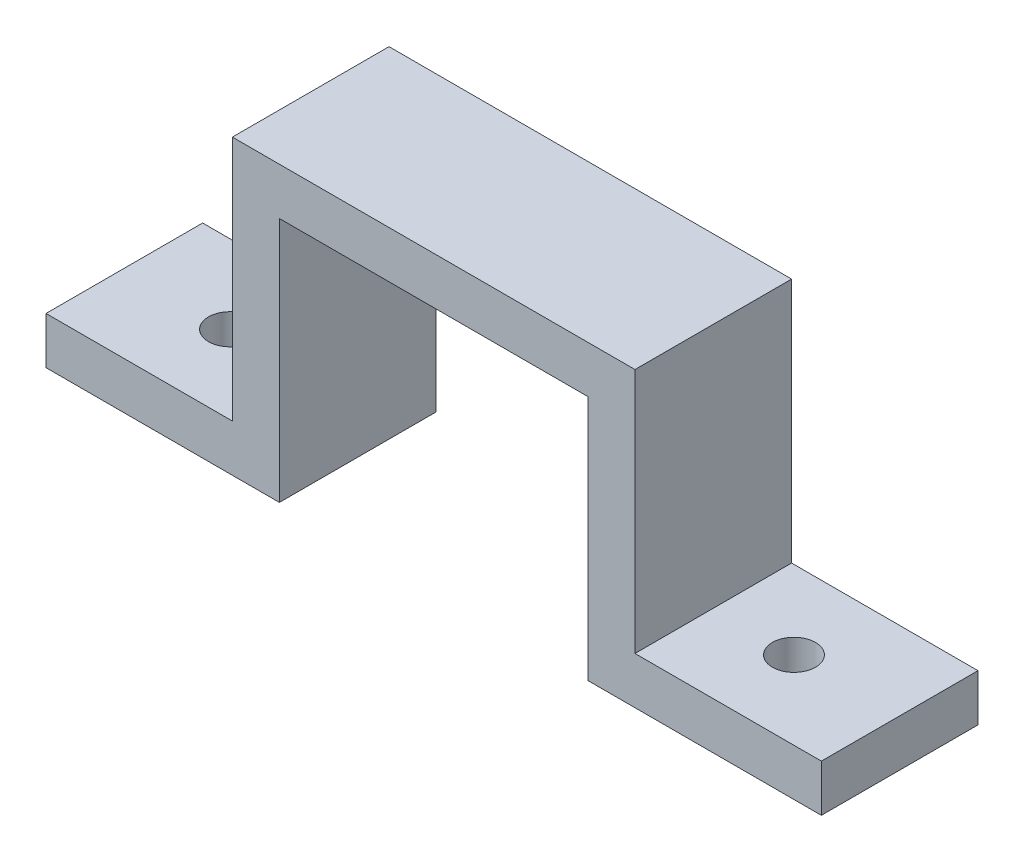
ISO-10303-21;
HEADER;
FILE_DESCRIPTION(('STEP AP214'),'2;1');
FILE_NAME('part.step','',(''),(''),'','','');
FILE_SCHEMA(('AUTOMOTIVE_DESIGN { 1 0 10303 214 1 1 1 1 }'));
ENDSEC;
DATA;
#1=APPLICATION_CONTEXT('core data for automotive mechanical design processes');
#2=APPLICATION_PROTOCOL_DEFINITION('international standard','automotive_design',2000,#1);
#3=PRODUCT_CONTEXT('',#1,'mechanical');
#4=PRODUCT('Part','Part','',(#3));
#5=PRODUCT_RELATED_PRODUCT_CATEGORY('part','',(#4));
#6=PRODUCT_DEFINITION_FORMATION('','',#4);
#7=PRODUCT_DEFINITION_CONTEXT('part definition',#1,'design');
#8=PRODUCT_DEFINITION('design','',#6,#7);
#9=PRODUCT_DEFINITION_SHAPE('','',#8);
#10=(LENGTH_UNIT() NAMED_UNIT(*) SI_UNIT(.MILLI.,.METRE.));
#11=(NAMED_UNIT(*) PLANE_ANGLE_UNIT() SI_UNIT($,.RADIAN.));
#12=(NAMED_UNIT(*) SI_UNIT($,.STERADIAN.) SOLID_ANGLE_UNIT());
#13=UNCERTAINTY_MEASURE_WITH_UNIT(LENGTH_MEASURE(1.E-05),#10,'distance_accuracy_value','');
#14=(GEOMETRIC_REPRESENTATION_CONTEXT(3) GLOBAL_UNCERTAINTY_ASSIGNED_CONTEXT((#13)) GLOBAL_UNIT_ASSIGNED_CONTEXT((#10,
#11,#12)) REPRESENTATION_CONTEXT('',''));
#15=CARTESIAN_POINT('',(0.,0.,0.));
#16=DIRECTION('',(0.,0.,1.));
#17=DIRECTION('',(1.,0.,0.));
#18=AXIS2_PLACEMENT_3D('',#15,#16,#17);
#19=CARTESIAN_POINT('',(0.,3.,0.));
#20=DIRECTION('',(0.,0.,-1.));
#21=DIRECTION('',(-1.,0.,0.));
#22=AXIS2_PLACEMENT_3D('',#19,#20,#21);
#23=PLANE('',#22);
#24=DIRECTION('',(1.,0.,0.));
#25=VECTOR('',#24,1.);
#26=CARTESIAN_POINT('',(0.,0.,0.));
#27=LINE('',#26,#25);
#28=CARTESIAN_POINT('',(34.6,0.,0.));
#29=VERTEX_POINT('',#28);
#30=CARTESIAN_POINT('',(49.5,0.,0.));
#31=VERTEX_POINT('',#30);
#32=EDGE_CURVE('E213',#29,#31,#27,.T.);
#33=ORIENTED_EDGE('',*,*,#32,.F.);
#34=DIRECTION('',(0.,-1.,0.));
#35=VECTOR('',#34,1.);
#36=CARTESIAN_POINT('',(34.6,18.7,0.));
#37=LINE('',#36,#35);
#38=CARTESIAN_POINT('',(34.6,15.7,0.));
#39=VERTEX_POINT('',#38);
#40=EDGE_CURVE('E209',#39,#29,#37,.T.);
#41=ORIENTED_EDGE('',*,*,#40,.F.);
#42=DIRECTION('',(-1.,0.,0.));
#43=VECTOR('',#42,1.);
#44=CARTESIAN_POINT('',(49.502,15.7,0.));
#45=LINE('',#44,#43);
#46=CARTESIAN_POINT('',(14.9,15.7,0.));
#47=VERTEX_POINT('',#46);
#48=EDGE_CURVE('E51',#39,#47,#45,.T.);
#49=ORIENTED_EDGE('',*,*,#48,.T.);
#50=DIRECTION('',(0.,-1.,0.));
#51=VECTOR('',#50,1.);
#52=CARTESIAN_POINT('',(14.9,18.7,0.));
#53=LINE('',#52,#51);
#54=CARTESIAN_POINT('',(14.9,0.,0.));
#55=VERTEX_POINT('',#54);
#56=EDGE_CURVE('E151',#47,#55,#53,.T.);
#57=ORIENTED_EDGE('',*,*,#56,.T.);
#58=DIRECTION('',(1.,0.,0.));
#59=VECTOR('',#58,1.);
#60=CARTESIAN_POINT('',(0.,0.,0.));
#61=LINE('',#60,#59);
#62=CARTESIAN_POINT('',(0.,0.,0.));
#63=VERTEX_POINT('',#62);
#64=EDGE_CURVE('E181',#63,#55,#61,.T.);
#65=ORIENTED_EDGE('',*,*,#64,.F.);
#66=DIRECTION('',(0.,-1.,0.));
#67=VECTOR('',#66,1.);
#68=CARTESIAN_POINT('',(0.,3.,0.));
#69=LINE('',#68,#67);
#70=CARTESIAN_POINT('',(0.,3.,0.));
#71=VERTEX_POINT('',#70);
#72=EDGE_CURVE('E191',#71,#63,#69,.T.);
#73=ORIENTED_EDGE('',*,*,#72,.F.);
#74=DIRECTION('',(1.,0.,0.));
#75=VECTOR('',#74,1.);
#76=CARTESIAN_POINT('',(0.,3.,0.));
#77=LINE('',#76,#75);
#78=CARTESIAN_POINT('',(11.89875271,3.,0.));
#79=VERTEX_POINT('',#78);
#80=EDGE_CURVE('E148',#71,#79,#77,.T.);
#81=ORIENTED_EDGE('',*,*,#80,.T.);
#82=DIRECTION('',(0.,-1.,0.));
#83=VECTOR('',#82,1.);
#84=CARTESIAN_POINT('',(11.89875271,18.7,0.));
#85=LINE('',#84,#83);
#86=CARTESIAN_POINT('',(11.89875271,18.7,0.));
#87=VERTEX_POINT('',#86);
#88=EDGE_CURVE('E146',#87,#79,#85,.T.);
#89=ORIENTED_EDGE('',*,*,#88,.F.);
#90=DIRECTION('',(1.,0.,0.));
#91=VECTOR('',#90,1.);
#92=CARTESIAN_POINT('',(0.,18.7,0.));
#93=LINE('',#92,#91);
#94=CARTESIAN_POINT('',(37.6,18.7,0.));
#95=VERTEX_POINT('',#94);
#96=EDGE_CURVE('E134',#87,#95,#93,.T.);
#97=ORIENTED_EDGE('',*,*,#96,.T.);
#98=DIRECTION('',(0.,-1.,0.));
#99=VECTOR('',#98,1.);
#100=CARTESIAN_POINT('',(37.6,18.7,0.));
#101=LINE('',#100,#99);
#102=CARTESIAN_POINT('',(37.6,3.,0.));
#103=VERTEX_POINT('',#102);
#104=EDGE_CURVE('E211',#95,#103,#101,.T.);
#105=ORIENTED_EDGE('',*,*,#104,.T.);
#106=DIRECTION('',(1.,0.,0.));
#107=VECTOR('',#106,1.);
#108=CARTESIAN_POINT('',(0.,3.,0.));
#109=LINE('',#108,#107);
#110=CARTESIAN_POINT('',(49.5,3.,0.));
#111=VERTEX_POINT('',#110);
#112=EDGE_CURVE('E214',#103,#111,#109,.T.);
#113=ORIENTED_EDGE('',*,*,#112,.T.);
#114=DIRECTION('',(0.,-1.,0.));
#115=VECTOR('',#114,1.);
#116=CARTESIAN_POINT('',(49.5,3.,0.));
#117=LINE('',#116,#115);
#118=EDGE_CURVE('E44',#111,#31,#117,.T.);
#119=ORIENTED_EDGE('',*,*,#118,.T.);
#120=EDGE_LOOP('',(#33,#41,#49,#57,#65,#73,#81,#89,#97,#105,#113,#119));
#121=FACE_BOUND('',#120,.T.);
#122=ADVANCED_FACE('F37',(#121),#23,.T.);
#123=CARTESIAN_POINT('',(0.,3.,10.));
#124=DIRECTION('',(0.,0.,-1.));
#125=DIRECTION('',(-1.,0.,0.));
#126=AXIS2_PLACEMENT_3D('',#123,#124,#125);
#127=PLANE('',#126);
#128=DIRECTION('',(1.,0.,0.));
#129=VECTOR('',#128,1.);
#130=CARTESIAN_POINT('',(0.,0.,10.));
#131=LINE('',#130,#129);
#132=CARTESIAN_POINT('',(34.6,0.,10.));
#133=VERTEX_POINT('',#132);
#134=CARTESIAN_POINT('',(49.5,0.,10.));
#135=VERTEX_POINT('',#134);
#136=EDGE_CURVE('E227',#133,#135,#131,.T.);
#137=ORIENTED_EDGE('',*,*,#136,.T.);
#138=DIRECTION('',(0.,-1.,0.));
#139=VECTOR('',#138,1.);
#140=CARTESIAN_POINT('',(49.5,3.,10.));
#141=LINE('',#140,#139);
#142=CARTESIAN_POINT('',(49.5,3.,10.));
#143=VERTEX_POINT('',#142);
#144=EDGE_CURVE('E11',#143,#135,#141,.T.);
#145=ORIENTED_EDGE('',*,*,#144,.F.);
#146=DIRECTION('',(1.,0.,0.));
#147=VECTOR('',#146,1.);
#148=CARTESIAN_POINT('',(0.,3.,10.));
#149=LINE('',#148,#147);
#150=CARTESIAN_POINT('',(37.6,3.,10.));
#151=VERTEX_POINT('',#150);
#152=EDGE_CURVE('E219',#151,#143,#149,.T.);
#153=ORIENTED_EDGE('',*,*,#152,.F.);
#154=DIRECTION('',(0.,-1.,0.));
#155=VECTOR('',#154,1.);
#156=CARTESIAN_POINT('',(37.6,18.7,10.));
#157=LINE('',#156,#155);
#158=CARTESIAN_POINT('',(37.6,18.7,10.));
#159=VERTEX_POINT('',#158);
#160=EDGE_CURVE('E77',#159,#151,#157,.T.);
#161=ORIENTED_EDGE('',*,*,#160,.F.);
#162=DIRECTION('',(1.,0.,0.));
#163=VECTOR('',#162,1.);
#164=CARTESIAN_POINT('',(0.,18.7,10.));
#165=LINE('',#164,#163);
#166=CARTESIAN_POINT('',(11.89875271,18.7,10.));
#167=VERTEX_POINT('',#166);
#168=EDGE_CURVE('E142',#167,#159,#165,.T.);
#169=ORIENTED_EDGE('',*,*,#168,.F.);
#170=DIRECTION('',(0.,-1.,0.));
#171=VECTOR('',#170,1.);
#172=CARTESIAN_POINT('',(11.89875271,18.7,10.));
#173=LINE('',#172,#171);
#174=CARTESIAN_POINT('',(11.89875271,3.,10.));
#175=VERTEX_POINT('',#174);
#176=EDGE_CURVE('E152',#167,#175,#173,.T.);
#177=ORIENTED_EDGE('',*,*,#176,.T.);
#178=DIRECTION('',(1.,0.,0.));
#179=VECTOR('',#178,1.);
#180=CARTESIAN_POINT('',(0.,3.,10.));
#181=LINE('',#180,#179);
#182=CARTESIAN_POINT('',(0.,3.,10.));
#183=VERTEX_POINT('',#182);
#184=EDGE_CURVE('E176',#183,#175,#181,.T.);
#185=ORIENTED_EDGE('',*,*,#184,.F.);
#186=DIRECTION('',(0.,-1.,0.));
#187=VECTOR('',#186,1.);
#188=CARTESIAN_POINT('',(0.,3.,10.));
#189=LINE('',#188,#187);
#190=CARTESIAN_POINT('',(0.,0.,10.));
#191=VERTEX_POINT('',#190);
#192=EDGE_CURVE('E178',#183,#191,#189,.T.);
#193=ORIENTED_EDGE('',*,*,#192,.T.);
#194=DIRECTION('',(1.,0.,0.));
#195=VECTOR('',#194,1.);
#196=CARTESIAN_POINT('',(0.,0.,10.));
#197=LINE('',#196,#195);
#198=CARTESIAN_POINT('',(14.9,0.,10.));
#199=VERTEX_POINT('',#198);
#200=EDGE_CURVE('E170',#191,#199,#197,.T.);
#201=ORIENTED_EDGE('',*,*,#200,.T.);
#202=DIRECTION('',(0.,-1.,0.));
#203=VECTOR('',#202,1.);
#204=CARTESIAN_POINT('',(14.9,18.7,10.));
#205=LINE('',#204,#203);
#206=CARTESIAN_POINT('',(14.9,15.7,10.));
#207=VERTEX_POINT('',#206);
#208=EDGE_CURVE('E156',#207,#199,#205,.T.);
#209=ORIENTED_EDGE('',*,*,#208,.F.);
#210=DIRECTION('',(-1.,0.,0.));
#211=VECTOR('',#210,1.);
#212=CARTESIAN_POINT('',(49.502,15.7,10.));
#213=LINE('',#212,#211);
#214=CARTESIAN_POINT('',(34.6,15.7,10.));
#215=VERTEX_POINT('',#214);
#216=EDGE_CURVE('E195',#215,#207,#213,.T.);
#217=ORIENTED_EDGE('',*,*,#216,.F.);
#218=DIRECTION('',(0.,-1.,0.));
#219=VECTOR('',#218,1.);
#220=CARTESIAN_POINT('',(34.6,18.7,10.));
#221=LINE('',#220,#219);
#222=EDGE_CURVE('E207',#215,#133,#221,.T.);
#223=ORIENTED_EDGE('',*,*,#222,.T.);
#224=EDGE_LOOP('',(#137,#145,#153,#161,#169,#177,#185,#193,#201,#209,#217,#223));
#225=FACE_BOUND('',#224,.T.);
#226=ADVANCED_FACE('F254',(#225),#127,.F.);
#227=CARTESIAN_POINT('',(49.5,3.,0.));
#228=DIRECTION('',(1.,0.,0.));
#229=DIRECTION('',(0.,0.,-1.));
#230=AXIS2_PLACEMENT_3D('',#227,#228,#229);
#231=PLANE('',#230);
#232=DIRECTION('',(0.,0.,1.));
#233=VECTOR('',#232,1.);
#234=CARTESIAN_POINT('',(49.5,0.,0.));
#235=LINE('',#234,#233);
#236=EDGE_CURVE('E230',#31,#135,#235,.T.);
#237=ORIENTED_EDGE('',*,*,#236,.F.);
#238=ORIENTED_EDGE('',*,*,#118,.F.);
#239=DIRECTION('',(0.,0.,1.));
#240=VECTOR('',#239,1.);
#241=CARTESIAN_POINT('',(49.5,3.,0.));
#242=LINE('',#241,#240);
#243=EDGE_CURVE('E221',#111,#143,#242,.T.);
#244=ORIENTED_EDGE('',*,*,#243,.T.);
#245=ORIENTED_EDGE('',*,*,#144,.T.);
#246=EDGE_LOOP('',(#237,#238,#244,#245));
#247=FACE_BOUND('',#246,.T.);
#248=ADVANCED_FACE('F258',(#247),#231,.T.);
#249=CARTESIAN_POINT('',(42.75,3.,5.));
#250=DIRECTION('',(0.,-1.,0.));
#251=DIRECTION('',(0.,0.,-1.));
#252=AXIS2_PLACEMENT_3D('',#249,#250,#251);
#253=CYLINDRICAL_SURFACE('',#252,1.375);
#254=CARTESIAN_POINT('',(42.75,3.,5.));
#255=DIRECTION('',(0.,1.,0.));
#256=DIRECTION('',(0.,0.,1.));
#257=AXIS2_PLACEMENT_3D('',#254,#255,#256);
#258=CIRCLE('',#257,1.375);
#259=CARTESIAN_POINT('',(42.75,3.,6.375));
#260=VERTEX_POINT('',#259);
#261=EDGE_CURVE('E223',#260,#260,#258,.F.);
#262=ORIENTED_EDGE('',*,*,#261,.F.);
#263=EDGE_LOOP('',(#262));
#264=FACE_BOUND('',#263,.T.);
#265=CARTESIAN_POINT('',(42.75,0.,5.));
#266=DIRECTION('',(0.,1.,0.));
#267=DIRECTION('',(0.,0.,1.));
#268=AXIS2_PLACEMENT_3D('',#265,#266,#267);
#269=CIRCLE('',#268,1.375);
#270=CARTESIAN_POINT('',(42.75,0.,6.375));
#271=VERTEX_POINT('',#270);
#272=EDGE_CURVE('E217',#271,#271,#269,.F.);
#273=ORIENTED_EDGE('',*,*,#272,.T.);
#274=EDGE_LOOP('',(#273));
#275=FACE_BOUND('',#274,.T.);
#276=ADVANCED_FACE('F236',(#264,#275),#253,.F.);
#277=CARTESIAN_POINT('',(0.,3.,0.));
#278=DIRECTION('',(0.,1.,0.));
#279=DIRECTION('',(0.,0.,1.));
#280=AXIS2_PLACEMENT_3D('',#277,#278,#279);
#281=PLANE('',#280);
#282=ORIENTED_EDGE('',*,*,#112,.F.);
#283=DIRECTION('',(0.,0.,1.));
#284=VECTOR('',#283,1.);
#285=CARTESIAN_POINT('',(37.6,3.,0.));
#286=LINE('',#285,#284);
#287=EDGE_CURVE('E216',#103,#151,#286,.T.);
#288=ORIENTED_EDGE('',*,*,#287,.T.);
#289=ORIENTED_EDGE('',*,*,#152,.T.);
#290=ORIENTED_EDGE('',*,*,#243,.F.);
#291=EDGE_LOOP('',(#282,#288,#289,#290));
#292=FACE_BOUND('',#291,.T.);
#293=ORIENTED_EDGE('',*,*,#261,.T.);
#294=EDGE_LOOP('',(#293));
#295=FACE_BOUND('',#294,.T.);
#296=ADVANCED_FACE('F241',(#292,#295),#281,.T.);
#297=CARTESIAN_POINT('',(0.,0.,0.));
#298=DIRECTION('',(0.,1.,0.));
#299=DIRECTION('',(0.,0.,1.));
#300=AXIS2_PLACEMENT_3D('',#297,#298,#299);
#301=PLANE('',#300);
#302=ORIENTED_EDGE('',*,*,#32,.T.);
#303=ORIENTED_EDGE('',*,*,#236,.T.);
#304=ORIENTED_EDGE('',*,*,#136,.F.);
#305=DIRECTION('',(0.,0.,1.));
#306=VECTOR('',#305,1.);
#307=CARTESIAN_POINT('',(34.6,0.,0.));
#308=LINE('',#307,#306);
#309=EDGE_CURVE('E201',#29,#133,#308,.T.);
#310=ORIENTED_EDGE('',*,*,#309,.F.);
#311=EDGE_LOOP('',(#302,#303,#304,#310));
#312=FACE_BOUND('',#311,.T.);
#313=ORIENTED_EDGE('',*,*,#272,.F.);
#314=EDGE_LOOP('',(#313));
#315=FACE_BOUND('',#314,.T.);
#316=ADVANCED_FACE('F238',(#312,#315),#301,.F.);
#317=CARTESIAN_POINT('',(37.6,18.7,0.));
#318=DIRECTION('',(1.,0.,0.));
#319=DIRECTION('',(0.,0.,-1.));
#320=AXIS2_PLACEMENT_3D('',#317,#318,#319);
#321=PLANE('',#320);
#322=ORIENTED_EDGE('',*,*,#287,.F.);
#323=ORIENTED_EDGE('',*,*,#104,.F.);
#324=DIRECTION('',(0.,0.,1.));
#325=VECTOR('',#324,1.);
#326=CARTESIAN_POINT('',(37.6,18.7,0.));
#327=LINE('',#326,#325);
#328=EDGE_CURVE('E140',#95,#159,#327,.T.);
#329=ORIENTED_EDGE('',*,*,#328,.T.);
#330=ORIENTED_EDGE('',*,*,#160,.T.);
#331=EDGE_LOOP('',(#322,#323,#329,#330));
#332=FACE_BOUND('',#331,.T.);
#333=ADVANCED_FACE('F240',(#332),#321,.T.);
#334=CARTESIAN_POINT('',(34.6,18.7,0.));
#335=DIRECTION('',(1.,0.,0.));
#336=DIRECTION('',(0.,0.,-1.));
#337=AXIS2_PLACEMENT_3D('',#334,#335,#336);
#338=PLANE('',#337);
#339=ORIENTED_EDGE('',*,*,#222,.F.);
#340=DIRECTION('',(0.,0.,-1.));
#341=VECTOR('',#340,1.);
#342=CARTESIAN_POINT('',(34.6,15.7,10.));
#343=LINE('',#342,#341);
#344=EDGE_CURVE('E198',#215,#39,#343,.T.);
#345=ORIENTED_EDGE('',*,*,#344,.T.);
#346=ORIENTED_EDGE('',*,*,#40,.T.);
#347=ORIENTED_EDGE('',*,*,#309,.T.);
#348=EDGE_LOOP('',(#339,#345,#346,#347));
#349=FACE_BOUND('',#348,.T.);
#350=ADVANCED_FACE('F248',(#349),#338,.F.);
#351=CARTESIAN_POINT('',(0.,18.7,0.));
#352=DIRECTION('',(0.,1.,0.));
#353=DIRECTION('',(0.,0.,1.));
#354=AXIS2_PLACEMENT_3D('',#351,#352,#353);
#355=PLANE('',#354);
#356=ORIENTED_EDGE('',*,*,#328,.F.);
#357=ORIENTED_EDGE('',*,*,#96,.F.);
#358=DIRECTION('',(0.,0.,1.));
#359=VECTOR('',#358,1.);
#360=CARTESIAN_POINT('',(11.89875271,18.7,0.));
#361=LINE('',#360,#359);
#362=EDGE_CURVE('E138',#87,#167,#361,.T.);
#363=ORIENTED_EDGE('',*,*,#362,.T.);
#364=ORIENTED_EDGE('',*,*,#168,.T.);
#365=EDGE_LOOP('',(#356,#357,#363,#364));
#366=FACE_BOUND('',#365,.T.);
#367=ADVANCED_FACE('F136',(#366),#355,.T.);
#368=CARTESIAN_POINT('',(49.502,15.7,10.));
#369=DIRECTION('',(0.,1.,0.));
#370=DIRECTION('',(0.,0.,1.));
#371=AXIS2_PLACEMENT_3D('',#368,#369,#370);
#372=PLANE('',#371);
#373=ORIENTED_EDGE('',*,*,#344,.F.);
#374=ORIENTED_EDGE('',*,*,#216,.T.);
#375=DIRECTION('',(0.,0.,-1.));
#376=VECTOR('',#375,1.);
#377=CARTESIAN_POINT('',(14.9,15.7,10.));
#378=LINE('',#377,#376);
#379=EDGE_CURVE('E193',#207,#47,#378,.T.);
#380=ORIENTED_EDGE('',*,*,#379,.T.);
#381=ORIENTED_EDGE('',*,*,#48,.F.);
#382=EDGE_LOOP('',(#373,#374,#380,#381));
#383=FACE_BOUND('',#382,.T.);
#384=ADVANCED_FACE('F317',(#383),#372,.F.);
#385=CARTESIAN_POINT('',(14.9,18.7,0.));
#386=DIRECTION('',(1.,0.,0.));
#387=DIRECTION('',(0.,0.,-1.));
#388=AXIS2_PLACEMENT_3D('',#385,#386,#387);
#389=PLANE('',#388);
#390=ORIENTED_EDGE('',*,*,#379,.F.);
#391=ORIENTED_EDGE('',*,*,#208,.T.);
#392=DIRECTION('',(0.,0.,1.));
#393=VECTOR('',#392,1.);
#394=CARTESIAN_POINT('',(14.9,0.,0.));
#395=LINE('',#394,#393);
#396=EDGE_CURVE('E157',#55,#199,#395,.T.);
#397=ORIENTED_EDGE('',*,*,#396,.F.);
#398=ORIENTED_EDGE('',*,*,#56,.F.);
#399=EDGE_LOOP('',(#390,#391,#397,#398));
#400=FACE_BOUND('',#399,.T.);
#401=ADVANCED_FACE('F327',(#400),#389,.T.);
#402=CARTESIAN_POINT('',(0.,3.,0.));
#403=DIRECTION('',(1.,0.,0.));
#404=DIRECTION('',(0.,0.,-1.));
#405=AXIS2_PLACEMENT_3D('',#402,#403,#404);
#406=PLANE('',#405);
#407=DIRECTION('',(0.,0.,1.));
#408=VECTOR('',#407,1.);
#409=CARTESIAN_POINT('',(0.,0.,0.));
#410=LINE('',#409,#408);
#411=EDGE_CURVE('E184',#63,#191,#410,.T.);
#412=ORIENTED_EDGE('',*,*,#411,.T.);
#413=ORIENTED_EDGE('',*,*,#192,.F.);
#414=DIRECTION('',(0.,0.,1.));
#415=VECTOR('',#414,1.);
#416=CARTESIAN_POINT('',(0.,3.,0.));
#417=LINE('',#416,#415);
#418=EDGE_CURVE('E173',#71,#183,#417,.T.);
#419=ORIENTED_EDGE('',*,*,#418,.F.);
#420=ORIENTED_EDGE('',*,*,#72,.T.);
#421=EDGE_LOOP('',(#412,#413,#419,#420));
#422=FACE_BOUND('',#421,.T.);
#423=ADVANCED_FACE('F336',(#422),#406,.F.);
#424=CARTESIAN_POINT('',(6.75,3.,5.));
#425=DIRECTION('',(0.,-1.,0.));
#426=DIRECTION('',(0.,0.,-1.));
#427=AXIS2_PLACEMENT_3D('',#424,#425,#426);
#428=CYLINDRICAL_SURFACE('',#427,1.375);
#429=CARTESIAN_POINT('',(6.75,3.,5.));
#430=DIRECTION('',(0.,1.,0.));
#431=DIRECTION('',(0.,0.,1.));
#432=AXIS2_PLACEMENT_3D('',#429,#430,#431);
#433=CIRCLE('',#432,1.375);
#434=CARTESIAN_POINT('',(6.75,3.,6.375));
#435=VERTEX_POINT('',#434);
#436=EDGE_CURVE('E166',#435,#435,#433,.T.);
#437=ORIENTED_EDGE('',*,*,#436,.T.);
#438=EDGE_LOOP('',(#437));
#439=FACE_BOUND('',#438,.T.);
#440=CARTESIAN_POINT('',(6.75,0.,5.));
#441=DIRECTION('',(0.,1.,0.));
#442=DIRECTION('',(0.,0.,1.));
#443=AXIS2_PLACEMENT_3D('',#440,#441,#442);
#444=CIRCLE('',#443,1.375);
#445=CARTESIAN_POINT('',(6.75,0.,6.375));
#446=VERTEX_POINT('',#445);
#447=EDGE_CURVE('E165',#446,#446,#444,.T.);
#448=ORIENTED_EDGE('',*,*,#447,.F.);
#449=EDGE_LOOP('',(#448));
#450=FACE_BOUND('',#449,.T.);
#451=ADVANCED_FACE('F346',(#439,#450),#428,.F.);
#452=CARTESIAN_POINT('',(0.,3.,0.));
#453=DIRECTION('',(0.,1.,0.));
#454=DIRECTION('',(0.,0.,1.));
#455=AXIS2_PLACEMENT_3D('',#452,#453,#454);
#456=PLANE('',#455);
#457=ORIENTED_EDGE('',*,*,#436,.F.);
#458=EDGE_LOOP('',(#457));
#459=FACE_BOUND('',#458,.T.);
#460=DIRECTION('',(0.,0.,1.));
#461=VECTOR('',#460,1.);
#462=CARTESIAN_POINT('',(11.89875271,3.,0.));
#463=LINE('',#462,#461);
#464=EDGE_CURVE('E169',#79,#175,#463,.T.);
#465=ORIENTED_EDGE('',*,*,#464,.F.);
#466=ORIENTED_EDGE('',*,*,#80,.F.);
#467=ORIENTED_EDGE('',*,*,#418,.T.);
#468=ORIENTED_EDGE('',*,*,#184,.T.);
#469=EDGE_LOOP('',(#465,#466,#467,#468));
#470=FACE_BOUND('',#469,.T.);
#471=ADVANCED_FACE('F356',(#459,#470),#456,.T.);
#472=CARTESIAN_POINT('',(0.,0.,0.));
#473=DIRECTION('',(0.,1.,0.));
#474=DIRECTION('',(0.,0.,1.));
#475=AXIS2_PLACEMENT_3D('',#472,#473,#474);
#476=PLANE('',#475);
#477=ORIENTED_EDGE('',*,*,#447,.T.);
#478=EDGE_LOOP('',(#477));
#479=FACE_BOUND('',#478,.T.);
#480=ORIENTED_EDGE('',*,*,#64,.T.);
#481=ORIENTED_EDGE('',*,*,#396,.T.);
#482=ORIENTED_EDGE('',*,*,#200,.F.);
#483=ORIENTED_EDGE('',*,*,#411,.F.);
#484=EDGE_LOOP('',(#480,#481,#482,#483));
#485=FACE_BOUND('',#484,.T.);
#486=ADVANCED_FACE('F366',(#479,#485),#476,.F.);
#487=CARTESIAN_POINT('',(11.89875271,18.7,0.));
#488=DIRECTION('',(1.,0.,0.));
#489=DIRECTION('',(0.,0.,-1.));
#490=AXIS2_PLACEMENT_3D('',#487,#488,#489);
#491=PLANE('',#490);
#492=ORIENTED_EDGE('',*,*,#88,.T.);
#493=ORIENTED_EDGE('',*,*,#464,.T.);
#494=ORIENTED_EDGE('',*,*,#176,.F.);
#495=ORIENTED_EDGE('',*,*,#362,.F.);
#496=EDGE_LOOP('',(#492,#493,#494,#495));
#497=FACE_BOUND('',#496,.T.);
#498=ADVANCED_FACE('F154',(#497),#491,.F.);
#499=CLOSED_SHELL('',(#122,#226,#248,#276,#296,#316,#333,#350,#367,#384,#401,#423,#451,#471,
#486,#498));
#500=MANIFOLD_SOLID_BREP('B2',#499);
#501=ADVANCED_BREP_SHAPE_REPRESENTATION('',(#18,#500),#14);
#502=SHAPE_DEFINITION_REPRESENTATION(#9,#501);
ENDSEC;
END-ISO-10303-21;
